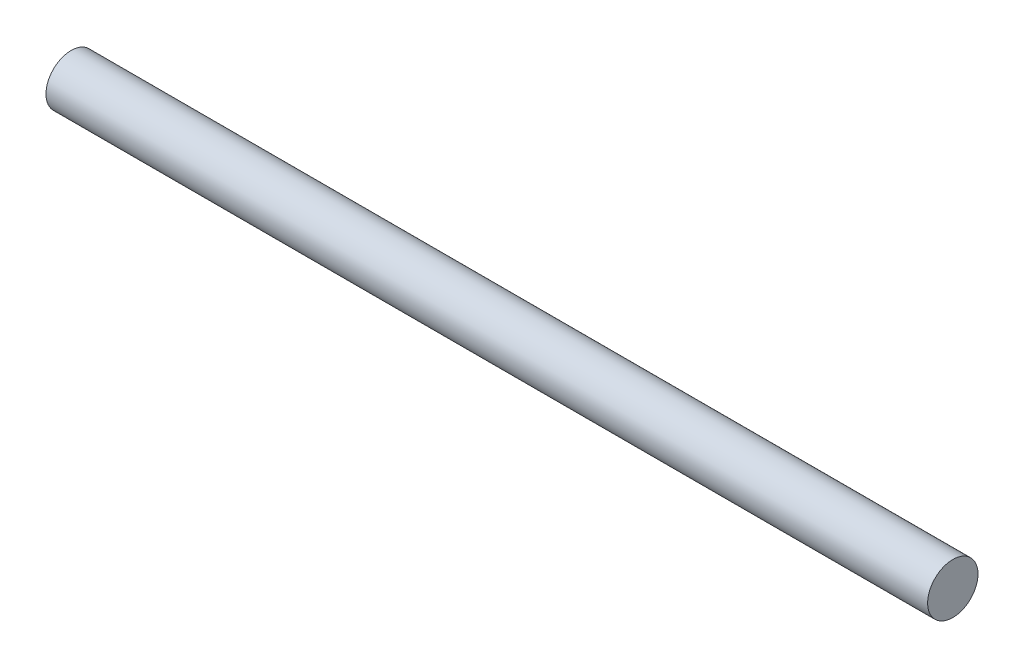
ISO-10303-21;
HEADER;
FILE_DESCRIPTION(('STEP AP214'),'2;1');
FILE_NAME('part.step','',(''),(''),'','','');
FILE_SCHEMA(('AUTOMOTIVE_DESIGN { 1 0 10303 214 1 1 1 1 }'));
ENDSEC;
DATA;
#1=APPLICATION_CONTEXT('core data for automotive mechanical design processes');
#2=APPLICATION_PROTOCOL_DEFINITION('international standard','automotive_design',2000,#1);
#3=PRODUCT_CONTEXT('',#1,'mechanical');
#4=PRODUCT('Part','Part','',(#3));
#5=PRODUCT_RELATED_PRODUCT_CATEGORY('part','',(#4));
#6=PRODUCT_DEFINITION_FORMATION('','',#4);
#7=PRODUCT_DEFINITION_CONTEXT('part definition',#1,'design');
#8=PRODUCT_DEFINITION('design','',#6,#7);
#9=PRODUCT_DEFINITION_SHAPE('','',#8);
#10=(LENGTH_UNIT() NAMED_UNIT(*) SI_UNIT(.MILLI.,.METRE.));
#11=(NAMED_UNIT(*) PLANE_ANGLE_UNIT() SI_UNIT($,.RADIAN.));
#12=(NAMED_UNIT(*) SI_UNIT($,.STERADIAN.) SOLID_ANGLE_UNIT());
#13=UNCERTAINTY_MEASURE_WITH_UNIT(LENGTH_MEASURE(1.E-05),#10,'distance_accuracy_value','');
#14=(GEOMETRIC_REPRESENTATION_CONTEXT(3) GLOBAL_UNCERTAINTY_ASSIGNED_CONTEXT((#13)) GLOBAL_UNIT_ASSIGNED_CONTEXT((#10,
#11,#12)) REPRESENTATION_CONTEXT('',''));
#15=CARTESIAN_POINT('',(0.,0.,0.));
#16=DIRECTION('',(0.,0.,1.));
#17=DIRECTION('',(1.,0.,0.));
#18=AXIS2_PLACEMENT_3D('',#15,#16,#17);
#19=CARTESIAN_POINT('',(70.,0.,0.));
#20=DIRECTION('',(-1.,0.,0.));
#21=DIRECTION('',(0.,0.,1.));
#22=AXIS2_PLACEMENT_3D('',#19,#20,#21);
#23=CYLINDRICAL_SURFACE('',#22,4.);
#24=CARTESIAN_POINT('',(70.,0.,0.));
#25=DIRECTION('',(1.,0.,0.));
#26=DIRECTION('',(0.,0.,-1.));
#27=AXIS2_PLACEMENT_3D('',#24,#25,#26);
#28=CIRCLE('',#27,4.);
#29=CARTESIAN_POINT('',(70.,0.,-4.));
#30=VERTEX_POINT('',#29);
#31=EDGE_CURVE('E10',#30,#30,#28,.T.);
#32=ORIENTED_EDGE('',*,*,#31,.F.);
#33=EDGE_LOOP('',(#32));
#34=FACE_BOUND('',#33,.T.);
#35=CARTESIAN_POINT('',(-70.,0.,0.));
#36=DIRECTION('',(1.,0.,0.));
#37=DIRECTION('',(0.,0.,-1.));
#38=AXIS2_PLACEMENT_3D('',#35,#36,#37);
#39=CIRCLE('',#38,4.);
#40=CARTESIAN_POINT('',(-70.,0.,-4.));
#41=VERTEX_POINT('',#40);
#42=EDGE_CURVE('E39',#41,#41,#39,.T.);
#43=ORIENTED_EDGE('',*,*,#42,.T.);
#44=EDGE_LOOP('',(#43));
#45=FACE_BOUND('',#44,.T.);
#46=ADVANCED_FACE('F36',(#34,#45),#23,.T.);
#47=CARTESIAN_POINT('',(70.,0.,0.));
#48=DIRECTION('',(1.,0.,0.));
#49=DIRECTION('',(0.,0.,-1.));
#50=AXIS2_PLACEMENT_3D('',#47,#48,#49);
#51=PLANE('',#50);
#52=ORIENTED_EDGE('',*,*,#31,.T.);
#53=EDGE_LOOP('',(#52));
#54=FACE_BOUND('',#53,.T.);
#55=ADVANCED_FACE('F51',(#54),#51,.T.);
#56=CARTESIAN_POINT('',(-70.,0.,0.));
#57=DIRECTION('',(1.,0.,0.));
#58=DIRECTION('',(0.,0.,-1.));
#59=AXIS2_PLACEMENT_3D('',#56,#57,#58);
#60=PLANE('',#59);
#61=ORIENTED_EDGE('',*,*,#42,.F.);
#62=EDGE_LOOP('',(#61));
#63=FACE_BOUND('',#62,.T.);
#64=ADVANCED_FACE('F49',(#63),#60,.F.);
#65=CLOSED_SHELL('',(#46,#55,#64));
#66=MANIFOLD_SOLID_BREP('B2',#65);
#67=ADVANCED_BREP_SHAPE_REPRESENTATION('',(#18,#66),#14);
#68=SHAPE_DEFINITION_REPRESENTATION(#9,#67);
ENDSEC;
END-ISO-10303-21;
